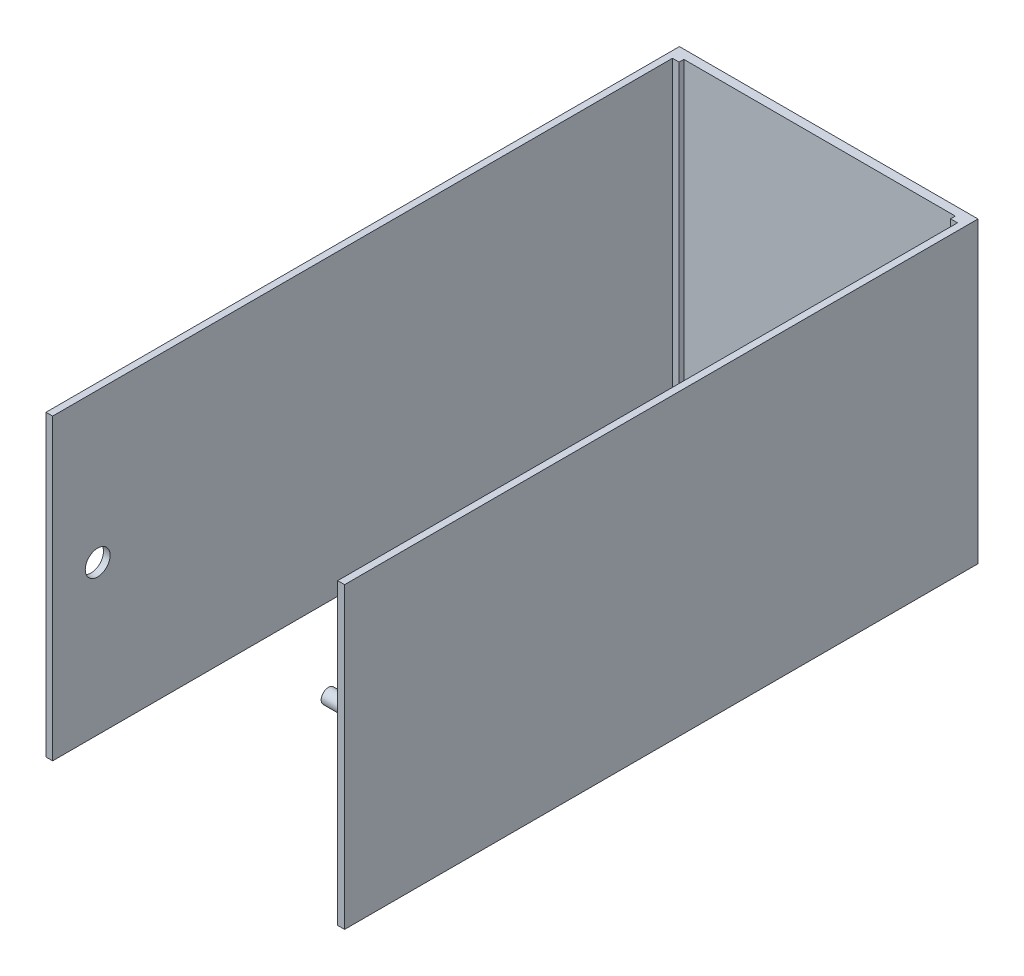
ISO-10303-21;
HEADER;
FILE_DESCRIPTION(('STEP AP214'),'2;1');
FILE_NAME('part.step','',(''),(''),'','','');
FILE_SCHEMA(('AUTOMOTIVE_DESIGN { 1 0 10303 214 1 1 1 1 }'));
ENDSEC;
DATA;
#1=APPLICATION_CONTEXT('core data for automotive mechanical design processes');
#2=APPLICATION_PROTOCOL_DEFINITION('international standard','automotive_design',2000,#1);
#3=PRODUCT_CONTEXT('',#1,'mechanical');
#4=PRODUCT('Part','Part','',(#3));
#5=PRODUCT_RELATED_PRODUCT_CATEGORY('part','',(#4));
#6=PRODUCT_DEFINITION_FORMATION('','',#4);
#7=PRODUCT_DEFINITION_CONTEXT('part definition',#1,'design');
#8=PRODUCT_DEFINITION('design','',#6,#7);
#9=PRODUCT_DEFINITION_SHAPE('','',#8);
#10=(LENGTH_UNIT() NAMED_UNIT(*) SI_UNIT(.MILLI.,.METRE.));
#11=(NAMED_UNIT(*) PLANE_ANGLE_UNIT() SI_UNIT($,.RADIAN.));
#12=(NAMED_UNIT(*) SI_UNIT($,.STERADIAN.) SOLID_ANGLE_UNIT());
#13=UNCERTAINTY_MEASURE_WITH_UNIT(LENGTH_MEASURE(1.E-05),#10,'distance_accuracy_value','');
#14=(GEOMETRIC_REPRESENTATION_CONTEXT(3) GLOBAL_UNCERTAINTY_ASSIGNED_CONTEXT((#13)) GLOBAL_UNIT_ASSIGNED_CONTEXT((#10,
#11,#12)) REPRESENTATION_CONTEXT('',''));
#15=CARTESIAN_POINT('',(0.,0.,0.));
#16=DIRECTION('',(0.,0.,1.));
#17=DIRECTION('',(1.,0.,0.));
#18=AXIS2_PLACEMENT_3D('',#15,#16,#17);
#19=CARTESIAN_POINT('',(29.9419821172067,-51.,11.9561689440938));
#20=DIRECTION('',(1.,0.,0.));
#21=DIRECTION('',(0.,0.,-1.));
#22=AXIS2_PLACEMENT_3D('',#19,#20,#21);
#23=PLANE('',#22);
#24=DIRECTION('',(0.,-1.,0.));
#25=VECTOR('',#24,1.);
#26=CARTESIAN_POINT('',(29.9419821172067,0.,13.));
#27=LINE('',#26,#25);
#28=CARTESIAN_POINT('',(29.9419821172067,33.,13.));
#29=VERTEX_POINT('',#28);
#30=CARTESIAN_POINT('',(29.9419821172067,-33.,13.));
#31=VERTEX_POINT('',#30);
#32=EDGE_CURVE('E48',#29,#31,#27,.T.);
#33=ORIENTED_EDGE('',*,*,#32,.F.);
#34=DIRECTION('',(0.,0.,-1.));
#35=VECTOR('',#34,1.);
#36=CARTESIAN_POINT('',(29.9419821172067,33.,11.9561689440938));
#37=LINE('',#36,#35);
#38=CARTESIAN_POINT('',(29.9419821172067,33.,11.9561689440938));
#39=VERTEX_POINT('',#38);
#40=EDGE_CURVE('E156',#29,#39,#37,.T.);
#41=ORIENTED_EDGE('',*,*,#40,.T.);
#42=DIRECTION('',(0.,1.,0.));
#43=VECTOR('',#42,1.);
#44=CARTESIAN_POINT('',(29.9419821172067,-51.,11.9561689440938));
#45=LINE('',#44,#43);
#46=CARTESIAN_POINT('',(29.9419821172067,-33.,11.9561689440938));
#47=VERTEX_POINT('',#46);
#48=EDGE_CURVE('E169',#47,#39,#45,.T.);
#49=ORIENTED_EDGE('',*,*,#48,.F.);
#50=DIRECTION('',(0.,0.,-1.));
#51=VECTOR('',#50,1.);
#52=CARTESIAN_POINT('',(29.9419821172067,-33.,70.));
#53=LINE('',#52,#51);
#54=EDGE_CURVE('E172',#31,#47,#53,.T.);
#55=ORIENTED_EDGE('',*,*,#54,.F.);
#56=EDGE_LOOP('',(#33,#41,#49,#55));
#57=FACE_BOUND('',#56,.T.);
#58=ADVANCED_FACE('F39',(#57),#23,.F.);
#59=CARTESIAN_POINT('',(0.,0.,10.));
#60=DIRECTION('',(0.,0.,-1.));
#61=DIRECTION('',(-1.,0.,0.));
#62=AXIS2_PLACEMENT_3D('',#59,#60,#61);
#63=CYLINDRICAL_SURFACE('',#62,5.);
#64=CARTESIAN_POINT('',(0.,0.,10.));
#65=DIRECTION('',(0.,0.,1.));
#66=DIRECTION('',(1.,0.,0.));
#67=AXIS2_PLACEMENT_3D('',#64,#65,#66);
#68=CIRCLE('',#67,5.);
#69=CARTESIAN_POINT('',(5.,0.,10.));
#70=VERTEX_POINT('',#69);
#71=EDGE_CURVE('E223',#70,#70,#68,.T.);
#72=ORIENTED_EDGE('',*,*,#71,.F.);
#73=EDGE_LOOP('',(#72));
#74=FACE_BOUND('',#73,.T.);
#75=CARTESIAN_POINT('',(0.,0.,0.));
#76=DIRECTION('',(0.,0.,1.));
#77=DIRECTION('',(1.,0.,0.));
#78=AXIS2_PLACEMENT_3D('',#75,#76,#77);
#79=CIRCLE('',#78,5.);
#80=CARTESIAN_POINT('',(5.,0.,0.));
#81=VERTEX_POINT('',#80);
#82=EDGE_CURVE('E219',#81,#81,#79,.T.);
#83=ORIENTED_EDGE('',*,*,#82,.T.);
#84=EDGE_LOOP('',(#83));
#85=FACE_BOUND('',#84,.T.);
#86=ADVANCED_FACE('F41',(#74,#85),#63,.T.);
#87=CARTESIAN_POINT('',(0.,0.,0.));
#88=DIRECTION('',(0.,0.,1.));
#89=DIRECTION('',(1.,0.,0.));
#90=AXIS2_PLACEMENT_3D('',#87,#88,#89);
#91=PLANE('',#90);
#92=CARTESIAN_POINT('',(0.,0.,0.));
#93=DIRECTION('',(0.,0.,-1.));
#94=DIRECTION('',(-1.,0.,0.));
#95=AXIS2_PLACEMENT_3D('',#92,#93,#94);
#96=CIRCLE('',#95,2.5);
#97=CARTESIAN_POINT('',(-2.5,0.,0.));
#98=VERTEX_POINT('',#97);
#99=EDGE_CURVE('E214',#98,#98,#96,.T.);
#100=ORIENTED_EDGE('',*,*,#99,.F.);
#101=EDGE_LOOP('',(#100));
#102=FACE_BOUND('',#101,.T.);
#103=ORIENTED_EDGE('',*,*,#82,.F.);
#104=EDGE_LOOP('',(#103));
#105=FACE_BOUND('',#104,.T.);
#106=ADVANCED_FACE('F321',(#102,#105),#91,.F.);
#107=CARTESIAN_POINT('',(0.,0.,3.));
#108=DIRECTION('',(0.,0.,-1.));
#109=DIRECTION('',(-1.,0.,0.));
#110=AXIS2_PLACEMENT_3D('',#107,#108,#109);
#111=CYLINDRICAL_SURFACE('',#110,2.5);
#112=CARTESIAN_POINT('',(0.,0.,3.));
#113=DIRECTION('',(0.,0.,-1.));
#114=DIRECTION('',(-1.,0.,0.));
#115=AXIS2_PLACEMENT_3D('',#112,#113,#114);
#116=CIRCLE('',#115,2.5);
#117=CARTESIAN_POINT('',(-2.5,0.,3.));
#118=VERTEX_POINT('',#117);
#119=EDGE_CURVE('E215',#118,#118,#116,.T.);
#120=ORIENTED_EDGE('',*,*,#119,.F.);
#121=EDGE_LOOP('',(#120));
#122=FACE_BOUND('',#121,.T.);
#123=ORIENTED_EDGE('',*,*,#99,.T.);
#124=EDGE_LOOP('',(#123));
#125=FACE_BOUND('',#124,.T.);
#126=ADVANCED_FACE('F352',(#122,#125),#111,.F.);
#127=CARTESIAN_POINT('',(0.,0.,3.));
#128=DIRECTION('',(0.,0.,-1.));
#129=DIRECTION('',(-1.,0.,0.));
#130=AXIS2_PLACEMENT_3D('',#127,#128,#129);
#131=PLANE('',#130);
#132=ORIENTED_EDGE('',*,*,#119,.T.);
#133=EDGE_LOOP('',(#132));
#134=FACE_BOUND('',#133,.T.);
#135=ADVANCED_FACE('F348',(#134),#131,.T.);
#136=CARTESIAN_POINT('',(-33.,33.,70.));
#137=DIRECTION('',(1.,0.,0.));
#138=DIRECTION('',(0.,1.,0.));
#139=AXIS2_PLACEMENT_3D('',#136,#137,#138);
#140=PLANE('',#139);
#141=CARTESIAN_POINT('',(-33.,0.,140.048047336272));
#142=DIRECTION('',(-1.,0.,0.));
#143=DIRECTION('',(0.,-1.,0.));
#144=AXIS2_PLACEMENT_3D('',#141,#142,#143);
#145=CIRCLE('',#144,2.75000000000001);
#146=CARTESIAN_POINT('',(-33.,-2.75000000000002,140.048047336272));
#147=VERTEX_POINT('',#146);
#148=EDGE_CURVE('E235',#147,#147,#145,.T.);
#149=ORIENTED_EDGE('',*,*,#148,.F.);
#150=EDGE_LOOP('',(#149));
#151=FACE_BOUND('',#150,.T.);
#152=DIRECTION('',(0.,-1.,0.));
#153=VECTOR('',#152,1.);
#154=CARTESIAN_POINT('',(-33.,33.,10.));
#155=LINE('',#154,#153);
#156=CARTESIAN_POINT('',(-33.,33.,10.));
#157=VERTEX_POINT('',#156);
#158=CARTESIAN_POINT('',(-33.,-33.,10.));
#159=VERTEX_POINT('',#158);
#160=EDGE_CURVE('E185',#157,#159,#155,.T.);
#161=ORIENTED_EDGE('',*,*,#160,.T.);
#162=DIRECTION('',(0.,0.,-1.));
#163=VECTOR('',#162,1.);
#164=CARTESIAN_POINT('',(-33.,-33.,70.));
#165=LINE('',#164,#163);
#166=CARTESIAN_POINT('',(-33.,-33.,150.));
#167=VERTEX_POINT('',#166);
#168=EDGE_CURVE('E210',#167,#159,#165,.T.);
#169=ORIENTED_EDGE('',*,*,#168,.F.);
#170=DIRECTION('',(0.,-1.,0.));
#171=VECTOR('',#170,1.);
#172=CARTESIAN_POINT('',(-33.,33.,150.));
#173=LINE('',#172,#171);
#174=CARTESIAN_POINT('',(-33.,33.,150.));
#175=VERTEX_POINT('',#174);
#176=EDGE_CURVE('E291',#175,#167,#173,.T.);
#177=ORIENTED_EDGE('',*,*,#176,.F.);
#178=DIRECTION('',(0.,0.,-1.));
#179=VECTOR('',#178,1.);
#180=CARTESIAN_POINT('',(-33.,33.,70.));
#181=LINE('',#180,#179);
#182=EDGE_CURVE('E198',#175,#157,#181,.T.);
#183=ORIENTED_EDGE('',*,*,#182,.T.);
#184=EDGE_LOOP('',(#161,#169,#177,#183));
#185=FACE_BOUND('',#184,.T.);
#186=ADVANCED_FACE('F345',(#151,#185),#140,.F.);
#187=CARTESIAN_POINT('',(33.,-33.,70.));
#188=DIRECTION('',(0.,1.,0.));
#189=DIRECTION('',(-1.,0.,0.));
#190=AXIS2_PLACEMENT_3D('',#187,#188,#189);
#191=PLANE('',#190);
#192=DIRECTION('',(1.,0.,0.));
#193=VECTOR('',#192,1.);
#194=CARTESIAN_POINT('',(-30.0580178827933,-33.,13.));
#195=LINE('',#194,#193);
#196=CARTESIAN_POINT('',(-31.5290089413967,-33.,13.));
#197=VERTEX_POINT('',#196);
#198=CARTESIAN_POINT('',(-30.0580178827933,-33.,13.));
#199=VERTEX_POINT('',#198);
#200=EDGE_CURVE('E135',#197,#199,#195,.T.);
#201=ORIENTED_EDGE('',*,*,#200,.F.);
#202=DIRECTION('',(0.,0.,1.));
#203=VECTOR('',#202,1.);
#204=CARTESIAN_POINT('',(-31.5290089413967,-33.,13.));
#205=LINE('',#204,#203);
#206=CARTESIAN_POINT('',(-31.5290089413967,-33.,150.));
#207=VERTEX_POINT('',#206);
#208=EDGE_CURVE('E258',#197,#207,#205,.T.);
#209=ORIENTED_EDGE('',*,*,#208,.T.);
#210=DIRECTION('',(1.,0.,0.));
#211=VECTOR('',#210,1.);
#212=CARTESIAN_POINT('',(-33.,-33.,150.));
#213=LINE('',#212,#211);
#214=EDGE_CURVE('E163',#167,#207,#213,.T.);
#215=ORIENTED_EDGE('',*,*,#214,.F.);
#216=ORIENTED_EDGE('',*,*,#168,.T.);
#217=DIRECTION('',(1.,0.,0.));
#218=VECTOR('',#217,1.);
#219=CARTESIAN_POINT('',(33.,-33.,10.));
#220=LINE('',#219,#218);
#221=CARTESIAN_POINT('',(33.,-33.,10.));
#222=VERTEX_POINT('',#221);
#223=EDGE_CURVE('E189',#159,#222,#220,.T.);
#224=ORIENTED_EDGE('',*,*,#223,.T.);
#225=DIRECTION('',(0.,0.,-1.));
#226=VECTOR('',#225,1.);
#227=CARTESIAN_POINT('',(33.,-33.,70.));
#228=LINE('',#227,#226);
#229=CARTESIAN_POINT('',(33.,-33.,150.));
#230=VERTEX_POINT('',#229);
#231=EDGE_CURVE('E206',#230,#222,#228,.T.);
#232=ORIENTED_EDGE('',*,*,#231,.F.);
#233=DIRECTION('',(1.,0.,0.));
#234=VECTOR('',#233,1.);
#235=CARTESIAN_POINT('',(33.,-33.,150.));
#236=LINE('',#235,#234);
#237=CARTESIAN_POINT('',(31.4709910586033,-33.,150.));
#238=VERTEX_POINT('',#237);
#239=EDGE_CURVE('E288',#238,#230,#236,.T.);
#240=ORIENTED_EDGE('',*,*,#239,.F.);
#241=DIRECTION('',(0.,0.,1.));
#242=VECTOR('',#241,1.);
#243=CARTESIAN_POINT('',(31.4709910586033,-33.,13.));
#244=LINE('',#243,#242);
#245=CARTESIAN_POINT('',(31.4709910586033,-33.,13.));
#246=VERTEX_POINT('',#245);
#247=EDGE_CURVE('E63',#246,#238,#244,.T.);
#248=ORIENTED_EDGE('',*,*,#247,.F.);
#249=DIRECTION('',(1.,0.,0.));
#250=VECTOR('',#249,1.);
#251=CARTESIAN_POINT('',(29.9419821172067,-33.,13.));
#252=LINE('',#251,#250);
#253=EDGE_CURVE('E240',#31,#246,#252,.T.);
#254=ORIENTED_EDGE('',*,*,#253,.F.);
#255=ORIENTED_EDGE('',*,*,#54,.T.);
#256=DIRECTION('',(-1.,0.,0.));
#257=VECTOR('',#256,1.);
#258=CARTESIAN_POINT('',(33.,-33.,11.9561689440938));
#259=LINE('',#258,#257);
#260=CARTESIAN_POINT('',(-30.0580178827933,-33.,11.9561689440939));
#261=VERTEX_POINT('',#260);
#262=EDGE_CURVE('E181',#47,#261,#259,.T.);
#263=ORIENTED_EDGE('',*,*,#262,.T.);
#264=DIRECTION('',(0.,0.,1.));
#265=VECTOR('',#264,1.);
#266=CARTESIAN_POINT('',(-30.0580178827933,-33.,70.));
#267=LINE('',#266,#265);
#268=EDGE_CURVE('E178',#261,#199,#267,.T.);
#269=ORIENTED_EDGE('',*,*,#268,.T.);
#270=EDGE_LOOP('',(#201,#209,#215,#216,#224,#232,#240,#248,#254,#255,#263,#269));
#271=FACE_BOUND('',#270,.T.);
#272=ADVANCED_FACE('F301',(#271),#191,.F.);
#273=CARTESIAN_POINT('',(33.,33.,70.));
#274=DIRECTION('',(-1.,0.,0.));
#275=DIRECTION('',(0.,-1.,0.));
#276=AXIS2_PLACEMENT_3D('',#273,#274,#275);
#277=PLANE('',#276);
#278=DIRECTION('',(0.,1.,0.));
#279=VECTOR('',#278,1.);
#280=CARTESIAN_POINT('',(33.,33.,10.));
#281=LINE('',#280,#279);
#282=CARTESIAN_POINT('',(33.,33.,10.));
#283=VERTEX_POINT('',#282);
#284=EDGE_CURVE('E192',#222,#283,#281,.T.);
#285=ORIENTED_EDGE('',*,*,#284,.T.);
#286=DIRECTION('',(0.,0.,-1.));
#287=VECTOR('',#286,1.);
#288=CARTESIAN_POINT('',(33.,33.,70.));
#289=LINE('',#288,#287);
#290=CARTESIAN_POINT('',(33.,33.,150.));
#291=VERTEX_POINT('',#290);
#292=EDGE_CURVE('E202',#291,#283,#289,.T.);
#293=ORIENTED_EDGE('',*,*,#292,.F.);
#294=DIRECTION('',(0.,1.,0.));
#295=VECTOR('',#294,1.);
#296=CARTESIAN_POINT('',(33.,33.,150.));
#297=LINE('',#296,#295);
#298=EDGE_CURVE('E262',#230,#291,#297,.T.);
#299=ORIENTED_EDGE('',*,*,#298,.F.);
#300=ORIENTED_EDGE('',*,*,#231,.T.);
#301=EDGE_LOOP('',(#285,#293,#299,#300));
#302=FACE_BOUND('',#301,.T.);
#303=ADVANCED_FACE('F339',(#302),#277,.F.);
#304=CARTESIAN_POINT('',(33.,33.,70.));
#305=DIRECTION('',(0.,-1.,0.));
#306=DIRECTION('',(1.,0.,0.));
#307=AXIS2_PLACEMENT_3D('',#304,#305,#306);
#308=PLANE('',#307);
#309=DIRECTION('',(-1.,0.,0.));
#310=VECTOR('',#309,1.);
#311=CARTESIAN_POINT('',(-33.,33.,150.));
#312=LINE('',#311,#310);
#313=CARTESIAN_POINT('',(-31.5290089413967,33.,150.));
#314=VERTEX_POINT('',#313);
#315=EDGE_CURVE('E157',#314,#175,#312,.T.);
#316=ORIENTED_EDGE('',*,*,#315,.F.);
#317=DIRECTION('',(0.,0.,1.));
#318=VECTOR('',#317,1.);
#319=CARTESIAN_POINT('',(-31.5290089413967,33.,13.));
#320=LINE('',#319,#318);
#321=CARTESIAN_POINT('',(-31.5290089413967,33.,13.));
#322=VERTEX_POINT('',#321);
#323=EDGE_CURVE('E55',#322,#314,#320,.T.);
#324=ORIENTED_EDGE('',*,*,#323,.F.);
#325=DIRECTION('',(-1.,0.,0.));
#326=VECTOR('',#325,1.);
#327=CARTESIAN_POINT('',(-30.0580178827933,33.,13.));
#328=LINE('',#327,#326);
#329=CARTESIAN_POINT('',(-30.0580178827933,33.,13.));
#330=VERTEX_POINT('',#329);
#331=EDGE_CURVE('E133',#330,#322,#328,.T.);
#332=ORIENTED_EDGE('',*,*,#331,.F.);
#333=DIRECTION('',(0.,0.,1.));
#334=VECTOR('',#333,1.);
#335=CARTESIAN_POINT('',(-30.0580178827933,33.,11.9561689440939));
#336=LINE('',#335,#334);
#337=CARTESIAN_POINT('',(-30.0580178827933,33.,11.9561689440939));
#338=VERTEX_POINT('',#337);
#339=EDGE_CURVE('E147',#338,#330,#336,.T.);
#340=ORIENTED_EDGE('',*,*,#339,.F.);
#341=DIRECTION('',(-1.,0.,0.));
#342=VECTOR('',#341,1.);
#343=CARTESIAN_POINT('',(29.9419821172067,33.,11.9561689440938));
#344=LINE('',#343,#342);
#345=EDGE_CURVE('E161',#39,#338,#344,.T.);
#346=ORIENTED_EDGE('',*,*,#345,.F.);
#347=ORIENTED_EDGE('',*,*,#40,.F.);
#348=DIRECTION('',(-1.,0.,0.));
#349=VECTOR('',#348,1.);
#350=CARTESIAN_POINT('',(29.9419821172067,33.,13.));
#351=LINE('',#350,#349);
#352=CARTESIAN_POINT('',(31.4709910586033,33.,13.));
#353=VERTEX_POINT('',#352);
#354=EDGE_CURVE('E272',#353,#29,#351,.T.);
#355=ORIENTED_EDGE('',*,*,#354,.F.);
#356=DIRECTION('',(0.,0.,1.));
#357=VECTOR('',#356,1.);
#358=CARTESIAN_POINT('',(31.4709910586033,33.,13.));
#359=LINE('',#358,#357);
#360=CARTESIAN_POINT('',(31.4709910586033,33.,150.));
#361=VERTEX_POINT('',#360);
#362=EDGE_CURVE('E257',#353,#361,#359,.T.);
#363=ORIENTED_EDGE('',*,*,#362,.T.);
#364=DIRECTION('',(-1.,0.,0.));
#365=VECTOR('',#364,1.);
#366=CARTESIAN_POINT('',(33.,33.,150.));
#367=LINE('',#366,#365);
#368=EDGE_CURVE('E284',#291,#361,#367,.T.);
#369=ORIENTED_EDGE('',*,*,#368,.F.);
#370=ORIENTED_EDGE('',*,*,#292,.T.);
#371=DIRECTION('',(-1.,0.,0.));
#372=VECTOR('',#371,1.);
#373=CARTESIAN_POINT('',(33.,33.,10.));
#374=LINE('',#373,#372);
#375=EDGE_CURVE('E195',#283,#157,#374,.T.);
#376=ORIENTED_EDGE('',*,*,#375,.T.);
#377=ORIENTED_EDGE('',*,*,#182,.F.);
#378=EDGE_LOOP('',(#316,#324,#332,#340,#346,#347,#355,#363,#369,#370,#376,#377));
#379=FACE_BOUND('',#378,.T.);
#380=ADVANCED_FACE('F145',(#379),#308,.F.);
#381=CARTESIAN_POINT('',(0.,0.,10.));
#382=DIRECTION('',(0.,0.,-1.));
#383=DIRECTION('',(-1.,0.,0.));
#384=AXIS2_PLACEMENT_3D('',#381,#382,#383);
#385=PLANE('',#384);
#386=ORIENTED_EDGE('',*,*,#71,.T.);
#387=EDGE_LOOP('',(#386));
#388=FACE_BOUND('',#387,.T.);
#389=ORIENTED_EDGE('',*,*,#160,.F.);
#390=ORIENTED_EDGE('',*,*,#375,.F.);
#391=ORIENTED_EDGE('',*,*,#284,.F.);
#392=ORIENTED_EDGE('',*,*,#223,.F.);
#393=EDGE_LOOP('',(#389,#390,#391,#392));
#394=FACE_BOUND('',#393,.T.);
#395=ADVANCED_FACE('F332',(#388,#394),#385,.T.);
#396=CARTESIAN_POINT('',(0.,0.,13.));
#397=DIRECTION('',(0.,0.,-1.));
#398=DIRECTION('',(-1.,0.,0.));
#399=AXIS2_PLACEMENT_3D('',#396,#397,#398);
#400=PLANE('',#399);
#401=ORIENTED_EDGE('',*,*,#354,.T.);
#402=ORIENTED_EDGE('',*,*,#32,.T.);
#403=ORIENTED_EDGE('',*,*,#253,.T.);
#404=DIRECTION('',(0.,1.,0.));
#405=VECTOR('',#404,1.);
#406=CARTESIAN_POINT('',(31.4709910586033,33.,13.));
#407=LINE('',#406,#405);
#408=EDGE_CURVE('E268',#246,#353,#407,.T.);
#409=ORIENTED_EDGE('',*,*,#408,.T.);
#410=EDGE_LOOP('',(#401,#402,#403,#409));
#411=FACE_BOUND('',#410,.T.);
#412=ADVANCED_FACE('F329',(#411),#400,.F.);
#413=CARTESIAN_POINT('',(29.9419821172067,-51.,11.9561689440938));
#414=DIRECTION('',(0.,0.,-1.));
#415=DIRECTION('',(-1.,0.,0.));
#416=AXIS2_PLACEMENT_3D('',#413,#414,#415);
#417=PLANE('',#416);
#418=ORIENTED_EDGE('',*,*,#48,.T.);
#419=ORIENTED_EDGE('',*,*,#345,.T.);
#420=DIRECTION('',(0.,1.,0.));
#421=VECTOR('',#420,1.);
#422=CARTESIAN_POINT('',(-30.0580178827933,-51.,11.9561689440939));
#423=LINE('',#422,#421);
#424=EDGE_CURVE('E153',#261,#338,#423,.T.);
#425=ORIENTED_EDGE('',*,*,#424,.F.);
#426=ORIENTED_EDGE('',*,*,#262,.F.);
#427=EDGE_LOOP('',(#418,#419,#425,#426));
#428=FACE_BOUND('',#427,.T.);
#429=ADVANCED_FACE('F325',(#428),#417,.F.);
#430=CARTESIAN_POINT('',(-30.0580178827933,-51.,11.9561689440939));
#431=DIRECTION('',(-1.,0.,0.));
#432=DIRECTION('',(0.,0.,1.));
#433=AXIS2_PLACEMENT_3D('',#430,#431,#432);
#434=PLANE('',#433);
#435=ORIENTED_EDGE('',*,*,#339,.T.);
#436=DIRECTION('',(0.,1.,0.));
#437=VECTOR('',#436,1.);
#438=CARTESIAN_POINT('',(-30.0580178827933,33.,13.));
#439=LINE('',#438,#437);
#440=EDGE_CURVE('E129',#199,#330,#439,.T.);
#441=ORIENTED_EDGE('',*,*,#440,.F.);
#442=ORIENTED_EDGE('',*,*,#268,.F.);
#443=ORIENTED_EDGE('',*,*,#424,.T.);
#444=EDGE_LOOP('',(#435,#441,#442,#443));
#445=FACE_BOUND('',#444,.T.);
#446=ADVANCED_FACE('F151',(#445),#434,.F.);
#447=CARTESIAN_POINT('',(0.,0.,150.));
#448=DIRECTION('',(0.,0.,1.));
#449=DIRECTION('',(1.,0.,0.));
#450=AXIS2_PLACEMENT_3D('',#447,#448,#449);
#451=PLANE('',#450);
#452=DIRECTION('',(0.,-1.,0.));
#453=VECTOR('',#452,1.);
#454=CARTESIAN_POINT('',(-31.5290089413967,33.,150.));
#455=LINE('',#454,#453);
#456=EDGE_CURVE('E140',#314,#207,#455,.T.);
#457=ORIENTED_EDGE('',*,*,#456,.F.);
#458=ORIENTED_EDGE('',*,*,#315,.T.);
#459=ORIENTED_EDGE('',*,*,#176,.T.);
#460=ORIENTED_EDGE('',*,*,#214,.T.);
#461=EDGE_LOOP('',(#457,#458,#459,#460));
#462=FACE_BOUND('',#461,.T.);
#463=ADVANCED_FACE('F298',(#462),#451,.T.);
#464=CARTESIAN_POINT('',(0.,0.,150.));
#465=DIRECTION('',(0.,0.,-1.));
#466=DIRECTION('',(-1.,0.,0.));
#467=AXIS2_PLACEMENT_3D('',#464,#465,#466);
#468=PLANE('',#467);
#469=ORIENTED_EDGE('',*,*,#368,.T.);
#470=DIRECTION('',(0.,1.,0.));
#471=VECTOR('',#470,1.);
#472=CARTESIAN_POINT('',(31.4709910586033,33.,150.));
#473=LINE('',#472,#471);
#474=EDGE_CURVE('E234',#238,#361,#473,.T.);
#475=ORIENTED_EDGE('',*,*,#474,.F.);
#476=ORIENTED_EDGE('',*,*,#239,.T.);
#477=ORIENTED_EDGE('',*,*,#298,.T.);
#478=EDGE_LOOP('',(#469,#475,#476,#477));
#479=FACE_BOUND('',#478,.T.);
#480=ADVANCED_FACE('F312',(#479),#468,.F.);
#481=CARTESIAN_POINT('',(31.4709910586033,33.,13.));
#482=DIRECTION('',(1.,0.,0.));
#483=DIRECTION('',(0.,0.,-1.));
#484=AXIS2_PLACEMENT_3D('',#481,#482,#483);
#485=PLANE('',#484);
#486=CARTESIAN_POINT('',(31.4709910586033,0.,140.048047336272));
#487=DIRECTION('',(1.,0.,0.));
#488=DIRECTION('',(0.,0.,-1.));
#489=AXIS2_PLACEMENT_3D('',#486,#487,#488);
#490=CIRCLE('',#489,1.59999999999999);
#491=CARTESIAN_POINT('',(31.4709910586033,0.,138.448047336272));
#492=VERTEX_POINT('',#491);
#493=EDGE_CURVE('E11',#492,#492,#490,.F.);
#494=ORIENTED_EDGE('',*,*,#493,.F.);
#495=EDGE_LOOP('',(#494));
#496=FACE_BOUND('',#495,.T.);
#497=ORIENTED_EDGE('',*,*,#474,.T.);
#498=ORIENTED_EDGE('',*,*,#362,.F.);
#499=ORIENTED_EDGE('',*,*,#408,.F.);
#500=ORIENTED_EDGE('',*,*,#247,.T.);
#501=EDGE_LOOP('',(#497,#498,#499,#500));
#502=FACE_BOUND('',#501,.T.);
#503=ADVANCED_FACE('F304',(#496,#502),#485,.F.);
#504=CARTESIAN_POINT('',(-31.5290089413967,33.,13.));
#505=DIRECTION('',(-1.,0.,0.));
#506=DIRECTION('',(0.,0.,1.));
#507=AXIS2_PLACEMENT_3D('',#504,#505,#506);
#508=PLANE('',#507);
#509=CARTESIAN_POINT('',(-31.5290089413967,0.,140.048047336272));
#510=DIRECTION('',(-1.,0.,0.));
#511=DIRECTION('',(0.,0.,1.));
#512=AXIS2_PLACEMENT_3D('',#509,#510,#511);
#513=CIRCLE('',#512,2.75000000000001);
#514=CARTESIAN_POINT('',(-31.5290089413967,0.,142.798047336272));
#515=VERTEX_POINT('',#514);
#516=EDGE_CURVE('E231',#515,#515,#513,.T.);
#517=ORIENTED_EDGE('',*,*,#516,.T.);
#518=EDGE_LOOP('',(#517));
#519=FACE_BOUND('',#518,.T.);
#520=ORIENTED_EDGE('',*,*,#456,.T.);
#521=ORIENTED_EDGE('',*,*,#208,.F.);
#522=DIRECTION('',(0.,-1.,0.));
#523=VECTOR('',#522,1.);
#524=CARTESIAN_POINT('',(-31.5290089413967,33.,13.));
#525=LINE('',#524,#523);
#526=EDGE_CURVE('E149',#322,#197,#525,.T.);
#527=ORIENTED_EDGE('',*,*,#526,.F.);
#528=ORIENTED_EDGE('',*,*,#323,.T.);
#529=EDGE_LOOP('',(#520,#521,#527,#528));
#530=FACE_BOUND('',#529,.T.);
#531=ADVANCED_FACE('F302',(#519,#530),#508,.F.);
#532=CARTESIAN_POINT('',(0.,0.,13.));
#533=DIRECTION('',(0.,0.,-1.));
#534=DIRECTION('',(-1.,0.,0.));
#535=AXIS2_PLACEMENT_3D('',#532,#533,#534);
#536=PLANE('',#535);
#537=ORIENTED_EDGE('',*,*,#440,.T.);
#538=ORIENTED_EDGE('',*,*,#331,.T.);
#539=ORIENTED_EDGE('',*,*,#526,.T.);
#540=ORIENTED_EDGE('',*,*,#200,.T.);
#541=EDGE_LOOP('',(#537,#538,#539,#540));
#542=FACE_BOUND('',#541,.T.);
#543=ADVANCED_FACE('F131',(#542),#536,.F.);
#544=CARTESIAN_POINT('',(16.,0.,140.048047336272));
#545=DIRECTION('',(-1.,0.,0.));
#546=DIRECTION('',(0.,-1.,0.));
#547=AXIS2_PLACEMENT_3D('',#544,#545,#546);
#548=CYLINDRICAL_SURFACE('',#547,2.75000000000001);
#549=ORIENTED_EDGE('',*,*,#148,.T.);
#550=EDGE_LOOP('',(#549));
#551=FACE_BOUND('',#550,.T.);
#552=ORIENTED_EDGE('',*,*,#516,.F.);
#553=EDGE_LOOP('',(#552));
#554=FACE_BOUND('',#553,.T.);
#555=ADVANCED_FACE('F310',(#551,#554),#548,.F.);
#556=CARTESIAN_POINT('',(19.4709910586033,0.,140.048047336272));
#557=DIRECTION('',(1.,0.,0.));
#558=DIRECTION('',(0.,0.,-1.));
#559=AXIS2_PLACEMENT_3D('',#556,#557,#558);
#560=CYLINDRICAL_SURFACE('',#559,1.59999999999999);
#561=CARTESIAN_POINT('',(19.4709910586033,0.,140.048047336272));
#562=DIRECTION('',(-1.,0.,0.));
#563=DIRECTION('',(0.,0.,1.));
#564=AXIS2_PLACEMENT_3D('',#561,#562,#563);
#565=CIRCLE('',#564,1.59999999999999);
#566=CARTESIAN_POINT('',(19.4709910586033,0.,141.648047336272));
#567=VERTEX_POINT('',#566);
#568=EDGE_CURVE('E243',#567,#567,#565,.T.);
#569=ORIENTED_EDGE('',*,*,#568,.F.);
#570=EDGE_LOOP('',(#569));
#571=FACE_BOUND('',#570,.T.);
#572=ORIENTED_EDGE('',*,*,#493,.T.);
#573=EDGE_LOOP('',(#572));
#574=FACE_BOUND('',#573,.T.);
#575=ADVANCED_FACE('F436',(#571,#574),#560,.T.);
#576=CARTESIAN_POINT('',(19.4709910586033,0.,140.048047336272));
#577=DIRECTION('',(-1.,0.,0.));
#578=DIRECTION('',(0.,0.,1.));
#579=AXIS2_PLACEMENT_3D('',#576,#577,#578);
#580=PLANE('',#579);
#581=ORIENTED_EDGE('',*,*,#568,.T.);
#582=EDGE_LOOP('',(#581));
#583=FACE_BOUND('',#582,.T.);
#584=ADVANCED_FACE('F441',(#583),#580,.T.);
#585=CLOSED_SHELL('',(#58,#86,#106,#126,#135,#186,#272,#303,#380,#395,#412,#429,#446,#463,#480,
#503,#531,#543,#555,#575,#584));
#586=MANIFOLD_SOLID_BREP('B2',#585);
#587=ADVANCED_BREP_SHAPE_REPRESENTATION('',(#18,#586),#14);
#588=SHAPE_DEFINITION_REPRESENTATION(#9,#587);
ENDSEC;
END-ISO-10303-21;
